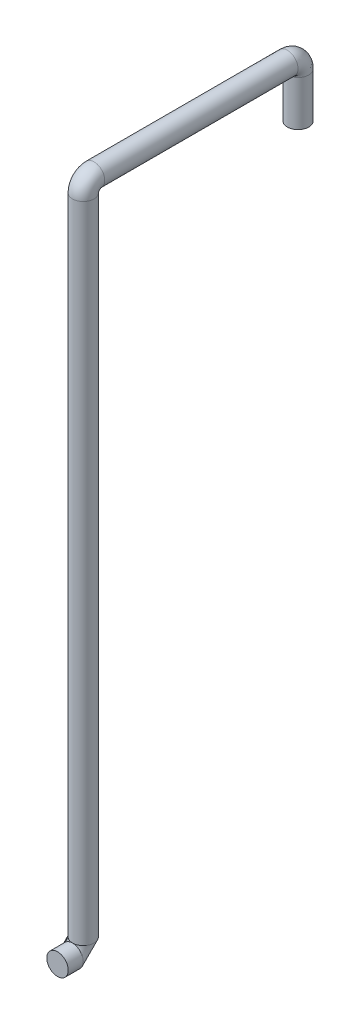
ISO-10303-21;
HEADER;
FILE_DESCRIPTION(('STEP AP214'),'2;1');
FILE_NAME('part.step','',(''),(''),'','','');
FILE_SCHEMA(('AUTOMOTIVE_DESIGN { 1 0 10303 214 1 1 1 1 }'));
ENDSEC;
DATA;
#1=APPLICATION_CONTEXT('core data for automotive mechanical design processes');
#2=APPLICATION_PROTOCOL_DEFINITION('international standard','automotive_design',2000,#1);
#3=PRODUCT_CONTEXT('',#1,'mechanical');
#4=PRODUCT('Part','Part','',(#3));
#5=PRODUCT_RELATED_PRODUCT_CATEGORY('part','',(#4));
#6=PRODUCT_DEFINITION_FORMATION('','',#4);
#7=PRODUCT_DEFINITION_CONTEXT('part definition',#1,'design');
#8=PRODUCT_DEFINITION('design','',#6,#7);
#9=PRODUCT_DEFINITION_SHAPE('','',#8);
#10=(LENGTH_UNIT() NAMED_UNIT(*) SI_UNIT(.MILLI.,.METRE.));
#11=(NAMED_UNIT(*) PLANE_ANGLE_UNIT() SI_UNIT($,.RADIAN.));
#12=(NAMED_UNIT(*) SI_UNIT($,.STERADIAN.) SOLID_ANGLE_UNIT());
#13=UNCERTAINTY_MEASURE_WITH_UNIT(LENGTH_MEASURE(1.E-05),#10,'distance_accuracy_value','');
#14=(GEOMETRIC_REPRESENTATION_CONTEXT(3) GLOBAL_UNCERTAINTY_ASSIGNED_CONTEXT((#13)) GLOBAL_UNIT_ASSIGNED_CONTEXT((#10,
#11,#12)) REPRESENTATION_CONTEXT('',''));
#15=CARTESIAN_POINT('',(0.,0.,0.));
#16=DIRECTION('',(0.,0.,1.));
#17=DIRECTION('',(1.,0.,0.));
#18=AXIS2_PLACEMENT_3D('',#15,#16,#17);
#19=CARTESIAN_POINT('',(0.,10.,0.));
#20=DIRECTION('',(0.,-1.,0.));
#21=DIRECTION('',(0.,0.,-1.));
#22=AXIS2_PLACEMENT_3D('',#19,#20,#21);
#23=CYLINDRICAL_SURFACE('',#22,50.);
#24=CARTESIAN_POINT('',(0.,0.,0.));
#25=DIRECTION('',(0.,1.,0.));
#26=DIRECTION('',(0.,0.,1.));
#27=AXIS2_PLACEMENT_3D('',#24,#25,#26);
#28=CIRCLE('',#27,50.);
#29=CARTESIAN_POINT('',(0.,0.,50.));
#30=VERTEX_POINT('',#29);
#31=EDGE_CURVE('E11',#30,#30,#28,.T.);
#32=ORIENTED_EDGE('',*,*,#31,.T.);
#33=EDGE_LOOP('',(#32));
#34=FACE_BOUND('',#33,.T.);
#35=CARTESIAN_POINT('',(0.,210.,0.));
#36=DIRECTION('',(0.,1.,0.));
#37=DIRECTION('',(0.,0.,1.));
#38=AXIS2_PLACEMENT_3D('',#35,#36,#37);
#39=CIRCLE('',#38,50.);
#40=CARTESIAN_POINT('',(0.,210.,50.));
#41=VERTEX_POINT('',#40);
#42=EDGE_CURVE('E51',#41,#41,#39,.T.);
#43=ORIENTED_EDGE('',*,*,#42,.F.);
#44=EDGE_LOOP('',(#43));
#45=FACE_BOUND('',#44,.T.);
#46=ADVANCED_FACE('F35',(#34,#45),#23,.T.);
#47=CARTESIAN_POINT('',(0.,0.,0.));
#48=DIRECTION('',(0.,1.,0.));
#49=DIRECTION('',(0.,0.,1.));
#50=AXIS2_PLACEMENT_3D('',#47,#48,#49);
#51=PLANE('',#50);
#52=ORIENTED_EDGE('',*,*,#31,.F.);
#53=EDGE_LOOP('',(#52));
#54=FACE_BOUND('',#53,.T.);
#55=ADVANCED_FACE('F96',(#54),#51,.F.);
#56=CARTESIAN_POINT('',(0.,-2840.,1120.));
#57=DIRECTION('',(0.,0.,1.));
#58=DIRECTION('',(0.,-1.,0.));
#59=AXIS2_PLACEMENT_3D('',#56,#57,#58);
#60=PLANE('',#59);
#61=CARTESIAN_POINT('',(0.,-2840.,1120.));
#62=DIRECTION('',(0.,0.,1.));
#63=DIRECTION('',(0.,-1.,0.));
#64=AXIS2_PLACEMENT_3D('',#61,#62,#63);
#65=CIRCLE('',#64,50.);
#66=CARTESIAN_POINT('',(0.,-2890.,1120.));
#67=VERTEX_POINT('',#66);
#68=EDGE_CURVE('E42',#67,#67,#65,.T.);
#69=ORIENTED_EDGE('',*,*,#68,.T.);
#70=EDGE_LOOP('',(#69));
#71=FACE_BOUND('',#70,.T.);
#72=ADVANCED_FACE('F93',(#71),#60,.T.);
#73=CARTESIAN_POINT('',(0.,210.,0.));
#74=DIRECTION('',(0.,-1.,0.));
#75=DIRECTION('',(0.,0.,-1.));
#76=AXIS2_PLACEMENT_3D('',#73,#74,#75);
#77=CIRCLE('',#76,50.);
#78=TRIMMED_CURVE('',#77,(PARAMETER_VALUE(-3.14159263868863)),
(PARAMETER_VALUE(3.14159263868863)),.T.,.PARAMETER.);
#79=CARTESIAN_POINT('',(0.,210.,50.));
#80=DIRECTION('',(1.,0.,0.));
#81=AXIS1_PLACEMENT('',#79,#80);
#82=SURFACE_OF_REVOLUTION('',#78,#81);
#83=CARTESIAN_POINT('',(0.,260.,50.));
#84=DIRECTION('',(0.,0.,1.));
#85=DIRECTION('',(0.,-1.,0.));
#86=AXIS2_PLACEMENT_3D('',#83,#84,#85);
#87=CIRCLE('',#86,50.);
#88=EDGE_CURVE('E75',#41,#41,#87,.T.);
#89=ORIENTED_EDGE('',*,*,#88,.F.);
#90=ORIENTED_EDGE('',*,*,#42,.T.);
#91=EDGE_LOOP('',(#89,#90));
#92=FACE_BOUND('',#91,.T.);
#93=ADVANCED_FACE('F80',(#92),#82,.T.);
#94=CARTESIAN_POINT('',(0.,260.,50.));
#95=DIRECTION('',(0.,0.,1.));
#96=DIRECTION('',(1.,0.,0.));
#97=AXIS2_PLACEMENT_3D('',#94,#95,#96);
#98=CYLINDRICAL_SURFACE('',#97,50.);
#99=CARTESIAN_POINT('',(0.,260.,950.));
#100=DIRECTION('',(0.,0.,1.));
#101=DIRECTION('',(0.,-1.,0.));
#102=AXIS2_PLACEMENT_3D('',#99,#100,#101);
#103=CIRCLE('',#102,50.);
#104=CARTESIAN_POINT('',(0.,210.,950.));
#105=VERTEX_POINT('',#104);
#106=EDGE_CURVE('E70',#105,#105,#103,.T.);
#107=ORIENTED_EDGE('',*,*,#106,.F.);
#108=EDGE_LOOP('',(#107));
#109=FACE_BOUND('',#108,.T.);
#110=ORIENTED_EDGE('',*,*,#88,.T.);
#111=EDGE_LOOP('',(#110));
#112=FACE_BOUND('',#111,.T.);
#113=ADVANCED_FACE('F82',(#109,#112),#98,.T.);
#114=CARTESIAN_POINT('',(0.,210.,900.));
#115=DIRECTION('',(0.,-1.,0.));
#116=DIRECTION('',(0.,0.,-1.));
#117=AXIS2_PLACEMENT_3D('',#114,#115,#116);
#118=CIRCLE('',#117,50.);
#119=TRIMMED_CURVE('',#118,(PARAMETER_VALUE(-3.14159263251637)),
(PARAMETER_VALUE(3.14159263251637)),.T.,.PARAMETER.);
#120=CARTESIAN_POINT('',(0.,210.,950.));
#121=DIRECTION('',(1.,0.,0.));
#122=AXIS1_PLACEMENT('',#120,#121);
#123=SURFACE_OF_REVOLUTION('',#119,#122);
#124=CARTESIAN_POINT('',(0.,210.,1000.));
#125=DIRECTION('',(0.,-1.,0.));
#126=DIRECTION('',(0.,0.,-1.));
#127=AXIS2_PLACEMENT_3D('',#124,#125,#126);
#128=CIRCLE('',#127,50.);
#129=EDGE_CURVE('E66',#105,#105,#128,.T.);
#130=ORIENTED_EDGE('',*,*,#129,.F.);
#131=ORIENTED_EDGE('',*,*,#106,.T.);
#132=EDGE_LOOP('',(#130,#131));
#133=FACE_BOUND('',#132,.T.);
#134=ADVANCED_FACE('F84',(#133),#123,.T.);
#135=CARTESIAN_POINT('',(0.,210.,1000.));
#136=DIRECTION('',(0.,-1.,0.));
#137=DIRECTION('',(1.,0.,0.));
#138=AXIS2_PLACEMENT_3D('',#135,#136,#137);
#139=CYLINDRICAL_SURFACE('',#138,50.);
#140=CARTESIAN_POINT('',(1.0657714916821E-13,-2790.,1000.));
#141=DIRECTION('',(0.,-1.,0.));
#142=DIRECTION('',(0.,0.,-1.));
#143=AXIS2_PLACEMENT_3D('',#140,#141,#142);
#144=CIRCLE('',#143,50.);
#145=CARTESIAN_POINT('',(0.,-2790.,1050.));
#146=VERTEX_POINT('',#145);
#147=EDGE_CURVE('E59',#146,#146,#144,.T.);
#148=ORIENTED_EDGE('',*,*,#147,.F.);
#149=EDGE_LOOP('',(#148));
#150=FACE_BOUND('',#149,.T.);
#151=ORIENTED_EDGE('',*,*,#129,.T.);
#152=EDGE_LOOP('',(#151));
#153=FACE_BOUND('',#152,.T.);
#154=ADVANCED_FACE('F60',(#150,#153),#139,.T.);
#155=CARTESIAN_POINT('',(0.,-2790.,1050.));
#156=DIRECTION('',(-1.,0.,0.));
#157=DIRECTION('',(0.,0.,1.));
#158=AXIS2_PLACEMENT_3D('',#155,#156,#157);
#159=TOROIDAL_SURFACE('',#158,50.,50.);
#160=CARTESIAN_POINT('',(0.,-2840.,1050.));
#161=DIRECTION('',(0.,0.,1.));
#162=DIRECTION('',(0.,-1.,0.));
#163=AXIS2_PLACEMENT_3D('',#160,#161,#162);
#164=CIRCLE('',#163,50.);
#165=EDGE_CURVE('E65',#146,#146,#164,.T.);
#166=ORIENTED_EDGE('',*,*,#165,.F.);
#167=ORIENTED_EDGE('',*,*,#147,.T.);
#168=EDGE_LOOP('',(#166,#167));
#169=FACE_BOUND('',#168,.T.);
#170=ADVANCED_FACE('F109',(#169),#159,.T.);
#171=CARTESIAN_POINT('',(1.00029074535319E-13,-2840.,1050.));
#172=DIRECTION('',(0.,0.,1.));
#173=DIRECTION('',(1.,0.,0.));
#174=AXIS2_PLACEMENT_3D('',#171,#172,#173);
#175=CYLINDRICAL_SURFACE('',#174,50.);
#176=ORIENTED_EDGE('',*,*,#68,.F.);
#177=EDGE_LOOP('',(#176));
#178=FACE_BOUND('',#177,.T.);
#179=ORIENTED_EDGE('',*,*,#165,.T.);
#180=EDGE_LOOP('',(#179));
#181=FACE_BOUND('',#180,.T.);
#182=ADVANCED_FACE('F102',(#178,#181),#175,.T.);
#183=CLOSED_SHELL('',(#46,#55,#72,#93,#113,#134,#154,#170,#182));
#184=MANIFOLD_SOLID_BREP('B2',#183);
#185=ADVANCED_BREP_SHAPE_REPRESENTATION('',(#18,#184),#14);
#186=SHAPE_DEFINITION_REPRESENTATION(#9,#185);
ENDSEC;
END-ISO-10303-21;
